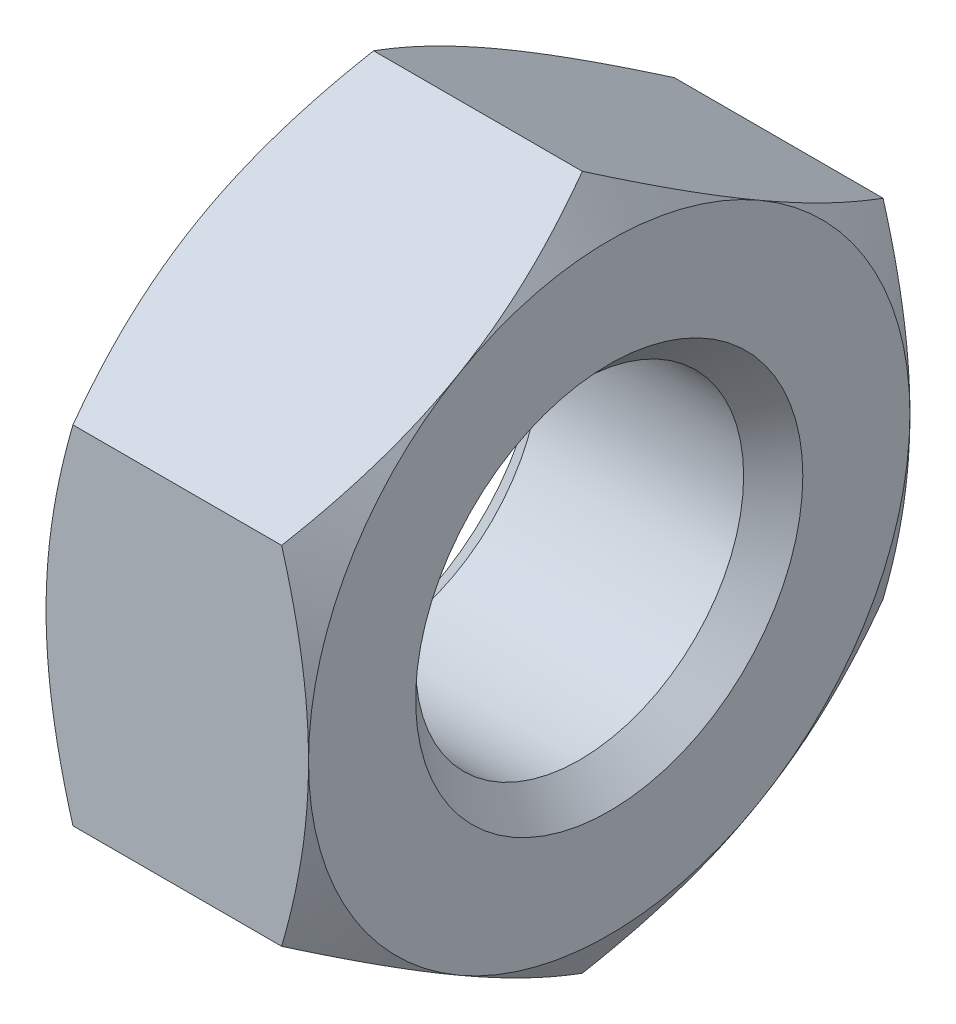
ISO-10303-21;
HEADER;
FILE_DESCRIPTION(('STEP AP214'),'2;1');
FILE_NAME('part.step','',(''),(''),'','','');
FILE_SCHEMA(('AUTOMOTIVE_DESIGN { 1 0 10303 214 1 1 1 1 }'));
ENDSEC;
DATA;
#1=APPLICATION_CONTEXT('core data for automotive mechanical design processes');
#2=APPLICATION_PROTOCOL_DEFINITION('international standard','automotive_design',2000,#1);
#3=PRODUCT_CONTEXT('',#1,'mechanical');
#4=PRODUCT('Part','Part','',(#3));
#5=PRODUCT_RELATED_PRODUCT_CATEGORY('part','',(#4));
#6=PRODUCT_DEFINITION_FORMATION('','',#4);
#7=PRODUCT_DEFINITION_CONTEXT('part definition',#1,'design');
#8=PRODUCT_DEFINITION('design','',#6,#7);
#9=PRODUCT_DEFINITION_SHAPE('','',#8);
#10=(LENGTH_UNIT() NAMED_UNIT(*) SI_UNIT(.MILLI.,.METRE.));
#11=(NAMED_UNIT(*) PLANE_ANGLE_UNIT() SI_UNIT($,.RADIAN.));
#12=(NAMED_UNIT(*) SI_UNIT($,.STERADIAN.) SOLID_ANGLE_UNIT());
#13=UNCERTAINTY_MEASURE_WITH_UNIT(LENGTH_MEASURE(1.E-05),#10,'distance_accuracy_value','');
#14=(GEOMETRIC_REPRESENTATION_CONTEXT(3) GLOBAL_UNCERTAINTY_ASSIGNED_CONTEXT((#13)) GLOBAL_UNIT_ASSIGNED_CONTEXT((#10,
#11,#12)) REPRESENTATION_CONTEXT('',''));
#15=CARTESIAN_POINT('',(0.,0.,0.));
#16=DIRECTION('',(0.,0.,1.));
#17=DIRECTION('',(1.,0.,0.));
#18=AXIS2_PLACEMENT_3D('',#15,#16,#17);
#19=CARTESIAN_POINT('',(0.,1.375,0.));
#20=DIRECTION('',(-1.,0.,0.));
#21=DIRECTION('',(0.,-1.,0.));
#22=AXIS2_PLACEMENT_3D('',#19,#20,#21);
#23=PLANE('',#22);
#24=CARTESIAN_POINT('',(0.,0.,0.));
#25=DIRECTION('',(-1.,0.,0.));
#26=DIRECTION('',(0.,-1.,0.));
#27=AXIS2_PLACEMENT_3D('',#24,#25,#26);
#28=CIRCLE('',#27,1.77062499999999);
#29=CARTESIAN_POINT('',(0.,-1.77062499999999,0.));
#30=VERTEX_POINT('',#29);
#31=EDGE_CURVE('E246',#30,#30,#28,.F.);
#32=ORIENTED_EDGE('',*,*,#31,.T.);
#33=EDGE_LOOP('',(#32));
#34=FACE_BOUND('',#33,.T.);
#35=CARTESIAN_POINT('',(0.,0.,0.));
#36=DIRECTION('',(1.,0.,0.));
#37=DIRECTION('',(0.,1.,0.));
#38=AXIS2_PLACEMENT_3D('',#35,#36,#37);
#39=CIRCLE('',#38,2.75);
#40=CARTESIAN_POINT('',(0.,2.38156986040721,-1.375));
#41=VERTEX_POINT('',#40);
#42=CARTESIAN_POINT('',(0.,2.38156986040721,1.375));
#43=VERTEX_POINT('',#42);
#44=EDGE_CURVE('E248',#41,#43,#39,.T.);
#45=ORIENTED_EDGE('',*,*,#44,.F.);
#46=CARTESIAN_POINT('',(0.,0.,0.));
#47=DIRECTION('',(1.,0.,0.));
#48=DIRECTION('',(0.,1.,0.));
#49=AXIS2_PLACEMENT_3D('',#46,#47,#48);
#50=CIRCLE('',#49,2.75);
#51=CARTESIAN_POINT('',(0.,0.,-2.75));
#52=VERTEX_POINT('',#51);
#53=EDGE_CURVE('E295',#52,#41,#50,.T.);
#54=ORIENTED_EDGE('',*,*,#53,.F.);
#55=CARTESIAN_POINT('',(0.,0.,0.));
#56=DIRECTION('',(1.,0.,0.));
#57=DIRECTION('',(0.,1.,0.));
#58=AXIS2_PLACEMENT_3D('',#55,#56,#57);
#59=CIRCLE('',#58,2.75);
#60=CARTESIAN_POINT('',(0.,-2.38156986040721,-1.375));
#61=VERTEX_POINT('',#60);
#62=EDGE_CURVE('E350',#61,#52,#59,.T.);
#63=ORIENTED_EDGE('',*,*,#62,.F.);
#64=CARTESIAN_POINT('',(0.,0.,0.));
#65=DIRECTION('',(1.,0.,0.));
#66=DIRECTION('',(0.,1.,0.));
#67=AXIS2_PLACEMENT_3D('',#64,#65,#66);
#68=CIRCLE('',#67,2.75);
#69=CARTESIAN_POINT('',(0.,-2.38156986040721,1.375));
#70=VERTEX_POINT('',#69);
#71=EDGE_CURVE('E106',#70,#61,#68,.T.);
#72=ORIENTED_EDGE('',*,*,#71,.F.);
#73=CARTESIAN_POINT('',(0.,0.,0.));
#74=DIRECTION('',(1.,0.,0.));
#75=DIRECTION('',(0.,1.,0.));
#76=AXIS2_PLACEMENT_3D('',#73,#74,#75);
#77=CIRCLE('',#76,2.75);
#78=CARTESIAN_POINT('',(0.,0.,2.75));
#79=VERTEX_POINT('',#78);
#80=EDGE_CURVE('E294',#79,#70,#77,.T.);
#81=ORIENTED_EDGE('',*,*,#80,.F.);
#82=CARTESIAN_POINT('',(0.,0.,0.));
#83=DIRECTION('',(1.,0.,0.));
#84=DIRECTION('',(0.,1.,0.));
#85=AXIS2_PLACEMENT_3D('',#82,#83,#84);
#86=CIRCLE('',#85,2.75);
#87=EDGE_CURVE('E320',#43,#79,#86,.T.);
#88=ORIENTED_EDGE('',*,*,#87,.F.);
#89=EDGE_LOOP('',(#45,#54,#63,#72,#81,#88));
#90=FACE_BOUND('',#89,.T.);
#91=ADVANCED_FACE('F55',(#34,#90),#23,.T.);
#92=CARTESIAN_POINT('',(-0.24,-2.38156986040721,-1.375));
#93=DIRECTION('',(0.,-0.866025403784439,-0.5));
#94=DIRECTION('',(0.,0.5,-0.866025403784439));
#95=AXIS2_PLACEMENT_3D('',#92,#93,#94);
#96=PLANE('',#95);
#97=CARTESIAN_POINT('',(0.246159375,-1.58677958820832,-2.75161713280996));
#98=CARTESIAN_POINT('',(0.,-2.01276454857648,-2.01378953819211));
#99=CARTESIAN_POINT('',(0.,-2.38156986040721,-1.375));
#100=CARTESIAN_POINT('',(0.,-2.75037517223794,-0.736210461807891));
#101=CARTESIAN_POINT('',(0.246159375,-3.17636013260609,0.00161713280995732));
#102=(BOUNDED_CURVE() B_SPLINE_CURVE(2,(#97,#98,#99,#100,#101),.UNSPECIFIED.,.F.,
.F.) B_SPLINE_CURVE_WITH_KNOTS((3,2,3),(0.,1.61264149368119,3.22528298736238),
.UNSPECIFIED.) CURVE() GEOMETRIC_REPRESENTATION_ITEM() RATIONAL_B_SPLINE_CURVE((1.,
1.03803665588276,1.,1.03803665588276,1.)) REPRESENTATION_ITEM(''));
#103=CARTESIAN_POINT('',(0.245620093061863,-1.58771324027147,-2.75));
#104=VERTEX_POINT('',#103);
#105=EDGE_CURVE('E292',#104,#61,#102,.T.);
#106=ORIENTED_EDGE('',*,*,#105,.F.);
#107=DIRECTION('',(1.,0.,0.));
#108=VECTOR('',#107,1.);
#109=CARTESIAN_POINT('',(-0.24,-1.58771324027147,-2.75));
#110=LINE('',#109,#108);
#111=CARTESIAN_POINT('',(2.15437990693814,-1.58771324027147,-2.75));
#112=VERTEX_POINT('',#111);
#113=EDGE_CURVE('E72',#104,#112,#110,.T.);
#114=ORIENTED_EDGE('',*,*,#113,.T.);
#115=CARTESIAN_POINT('',(2.153840625,-3.17636013260609,0.0016171328099566));
#116=CARTESIAN_POINT('',(2.4,-2.75037517223793,-0.736210461807895));
#117=CARTESIAN_POINT('',(2.4,-2.38156986040721,-1.375));
#118=CARTESIAN_POINT('',(2.4,-2.01276454857647,-2.01378953819211));
#119=CARTESIAN_POINT('',(2.153840625,-1.58677958820832,-2.75161713280996));
#120=(BOUNDED_CURVE() B_SPLINE_CURVE(2,(#115,#116,#117,#118,#119),.UNSPECIFIED.,.F.,
.F.) B_SPLINE_CURVE_WITH_KNOTS((3,2,3),(0.,1.61264149368119,3.22528298736238),
.UNSPECIFIED.) CURVE() GEOMETRIC_REPRESENTATION_ITEM() RATIONAL_B_SPLINE_CURVE((1.,
1.03803665588275,1.,1.03803665588276,1.)) REPRESENTATION_ITEM(''));
#121=CARTESIAN_POINT('',(2.4,-2.38156986040721,-1.375));
#122=VERTEX_POINT('',#121);
#123=EDGE_CURVE('E390',#122,#112,#120,.T.);
#124=ORIENTED_EDGE('',*,*,#123,.F.);
#125=CARTESIAN_POINT('',(2.153840625,-3.17636013260609,0.0016171328099566));
#126=CARTESIAN_POINT('',(2.4,-2.75037517223793,-0.736210461807895));
#127=CARTESIAN_POINT('',(2.4,-2.38156986040721,-1.375));
#128=CARTESIAN_POINT('',(2.4,-2.01276454857647,-2.01378953819211));
#129=CARTESIAN_POINT('',(2.153840625,-1.58677958820832,-2.75161713280996));
#130=(BOUNDED_CURVE() B_SPLINE_CURVE(2,(#125,#126,#127,#128,#129),.UNSPECIFIED.,.F.,
.F.) B_SPLINE_CURVE_WITH_KNOTS((3,2,3),(0.,1.61264149368119,3.22528298736238),
.UNSPECIFIED.) CURVE() GEOMETRIC_REPRESENTATION_ITEM() RATIONAL_B_SPLINE_CURVE((1.,
1.03803665588275,1.,1.03803665588276,1.)) REPRESENTATION_ITEM(''));
#131=CARTESIAN_POINT('',(2.15437990693814,-3.17542648054294,0.));
#132=VERTEX_POINT('',#131);
#133=EDGE_CURVE('E212',#132,#122,#130,.T.);
#134=ORIENTED_EDGE('',*,*,#133,.F.);
#135=DIRECTION('',(1.,0.,0.));
#136=VECTOR('',#135,1.);
#137=CARTESIAN_POINT('',(-0.24,-3.17542648054294,0.));
#138=LINE('',#137,#136);
#139=CARTESIAN_POINT('',(0.245620093061863,-3.17542648054294,0.));
#140=VERTEX_POINT('',#139);
#141=EDGE_CURVE('E147',#140,#132,#138,.T.);
#142=ORIENTED_EDGE('',*,*,#141,.F.);
#143=CARTESIAN_POINT('',(0.246159375,-1.58677958820832,-2.75161713280996));
#144=CARTESIAN_POINT('',(0.,-2.01276454857648,-2.01378953819211));
#145=CARTESIAN_POINT('',(0.,-2.38156986040721,-1.375));
#146=CARTESIAN_POINT('',(0.,-2.75037517223794,-0.736210461807891));
#147=CARTESIAN_POINT('',(0.246159375,-3.17636013260609,0.00161713280995732));
#148=(BOUNDED_CURVE() B_SPLINE_CURVE(2,(#143,#144,#145,#146,#147),.UNSPECIFIED.,.F.,
.F.) B_SPLINE_CURVE_WITH_KNOTS((3,2,3),(0.,1.61264149368119,3.22528298736238),
.UNSPECIFIED.) CURVE() GEOMETRIC_REPRESENTATION_ITEM() RATIONAL_B_SPLINE_CURVE((1.,
1.03803665588276,1.,1.03803665588276,1.)) REPRESENTATION_ITEM(''));
#149=EDGE_CURVE('E348',#61,#140,#148,.T.);
#150=ORIENTED_EDGE('',*,*,#149,.F.);
#151=EDGE_LOOP('',(#106,#114,#124,#134,#142,#150));
#152=FACE_BOUND('',#151,.T.);
#153=ADVANCED_FACE('F406',(#152),#96,.T.);
#154=CARTESIAN_POINT('',(-0.24,0.,-2.75));
#155=DIRECTION('',(0.,0.,-1.));
#156=DIRECTION('',(0.,1.,0.));
#157=AXIS2_PLACEMENT_3D('',#154,#155,#156);
#158=PLANE('',#157);
#159=CARTESIAN_POINT('',(0.246159375,1.58958054439776,-2.75));
#160=CARTESIAN_POINT('',(0.,0.737610623661457,-2.75));
#161=CARTESIAN_POINT('',(0.,0.,-2.75));
#162=CARTESIAN_POINT('',(0.,-0.737610623661457,-2.75));
#163=CARTESIAN_POINT('',(0.246159375,-1.58958054439776,-2.75));
#164=(BOUNDED_CURVE() B_SPLINE_CURVE(2,(#159,#160,#161,#162,#163),.UNSPECIFIED.,.F.,
.F.) B_SPLINE_CURVE_WITH_KNOTS((3,2,3),(0.,1.61264149368119,3.22528298736238),
.UNSPECIFIED.) CURVE() GEOMETRIC_REPRESENTATION_ITEM() RATIONAL_B_SPLINE_CURVE((1.,
1.03803665588276,1.,1.03803665588276,1.)) REPRESENTATION_ITEM(''));
#165=CARTESIAN_POINT('',(0.245620093061863,1.58771324027147,-2.75));
#166=VERTEX_POINT('',#165);
#167=EDGE_CURVE('E148',#166,#52,#164,.T.);
#168=ORIENTED_EDGE('',*,*,#167,.F.);
#169=DIRECTION('',(1.,0.,0.));
#170=VECTOR('',#169,1.);
#171=CARTESIAN_POINT('',(-0.24,1.58771324027147,-2.75));
#172=LINE('',#171,#170);
#173=CARTESIAN_POINT('',(2.15437990693814,1.58771324027147,-2.75));
#174=VERTEX_POINT('',#173);
#175=EDGE_CURVE('E136',#166,#174,#172,.T.);
#176=ORIENTED_EDGE('',*,*,#175,.T.);
#177=CARTESIAN_POINT('',(2.153840625,-1.58958054439775,-2.75));
#178=CARTESIAN_POINT('',(2.4,-0.737610623661457,-2.75));
#179=CARTESIAN_POINT('',(2.4,0.,-2.75));
#180=CARTESIAN_POINT('',(2.4,0.737610623661457,-2.75));
#181=CARTESIAN_POINT('',(2.153840625,1.58958054439775,-2.75));
#182=(BOUNDED_CURVE() B_SPLINE_CURVE(2,(#177,#178,#179,#180,#181),.UNSPECIFIED.,.F.,
.F.) B_SPLINE_CURVE_WITH_KNOTS((3,2,3),(0.,1.61264149368119,3.22528298736238),
.UNSPECIFIED.) CURVE() GEOMETRIC_REPRESENTATION_ITEM() RATIONAL_B_SPLINE_CURVE((1.,
1.03803665588277,1.,1.03803665588277,1.)) REPRESENTATION_ITEM(''));
#183=CARTESIAN_POINT('',(2.4,0.,-2.75));
#184=VERTEX_POINT('',#183);
#185=EDGE_CURVE('E141',#184,#174,#182,.T.);
#186=ORIENTED_EDGE('',*,*,#185,.F.);
#187=CARTESIAN_POINT('',(2.153840625,-1.58958054439775,-2.75));
#188=CARTESIAN_POINT('',(2.4,-0.737610623661457,-2.75));
#189=CARTESIAN_POINT('',(2.4,0.,-2.75));
#190=CARTESIAN_POINT('',(2.4,0.737610623661457,-2.75));
#191=CARTESIAN_POINT('',(2.153840625,1.58958054439775,-2.75));
#192=(BOUNDED_CURVE() B_SPLINE_CURVE(2,(#187,#188,#189,#190,#191),.UNSPECIFIED.,.F.,
.F.) B_SPLINE_CURVE_WITH_KNOTS((3,2,3),(0.,1.61264149368119,3.22528298736238),
.UNSPECIFIED.) CURVE() GEOMETRIC_REPRESENTATION_ITEM() RATIONAL_B_SPLINE_CURVE((1.,
1.03803665588277,1.,1.03803665588277,1.)) REPRESENTATION_ITEM(''));
#193=EDGE_CURVE('E380',#112,#184,#192,.T.);
#194=ORIENTED_EDGE('',*,*,#193,.F.);
#195=ORIENTED_EDGE('',*,*,#113,.F.);
#196=CARTESIAN_POINT('',(0.246159375,1.58958054439776,-2.75));
#197=CARTESIAN_POINT('',(0.,0.737610623661457,-2.75));
#198=CARTESIAN_POINT('',(0.,0.,-2.75));
#199=CARTESIAN_POINT('',(0.,-0.737610623661457,-2.75));
#200=CARTESIAN_POINT('',(0.246159375,-1.58958054439776,-2.75));
#201=(BOUNDED_CURVE() B_SPLINE_CURVE(2,(#196,#197,#198,#199,#200),.UNSPECIFIED.,.F.,
.F.) B_SPLINE_CURVE_WITH_KNOTS((3,2,3),(0.,1.61264149368119,3.22528298736238),
.UNSPECIFIED.) CURVE() GEOMETRIC_REPRESENTATION_ITEM() RATIONAL_B_SPLINE_CURVE((1.,
1.03803665588276,1.,1.03803665588276,1.)) REPRESENTATION_ITEM(''));
#202=EDGE_CURVE('E284',#52,#104,#201,.T.);
#203=ORIENTED_EDGE('',*,*,#202,.F.);
#204=EDGE_LOOP('',(#168,#176,#186,#194,#195,#203));
#205=FACE_BOUND('',#204,.T.);
#206=ADVANCED_FACE('F142',(#205),#158,.T.);
#207=CARTESIAN_POINT('',(-0.24,2.38156986040721,-1.375));
#208=DIRECTION('',(0.,0.866025403784439,-0.5));
#209=DIRECTION('',(0.,0.5,0.866025403784439));
#210=AXIS2_PLACEMENT_3D('',#207,#208,#209);
#211=PLANE('',#210);
#212=CARTESIAN_POINT('',(0.246159375,3.17636013260609,0.00161713280995494));
#213=CARTESIAN_POINT('',(0.,2.75037517223794,-0.736210461807897));
#214=CARTESIAN_POINT('',(0.,2.38156986040721,-1.375));
#215=CARTESIAN_POINT('',(0.,2.01276454857648,-2.01378953819211));
#216=CARTESIAN_POINT('',(0.246159375,1.58677958820832,-2.75161713280996));
#217=(BOUNDED_CURVE() B_SPLINE_CURVE(2,(#212,#213,#214,#215,#216),.UNSPECIFIED.,.F.,
.F.) B_SPLINE_CURVE_WITH_KNOTS((3,2,3),(0.,1.61264149368119,3.22528298736238),
.UNSPECIFIED.) CURVE() GEOMETRIC_REPRESENTATION_ITEM() RATIONAL_B_SPLINE_CURVE((1.,
1.03803665588275,1.,1.03803665588274,1.)) REPRESENTATION_ITEM(''));
#218=CARTESIAN_POINT('',(0.245620093061863,3.17542648054294,0.));
#219=VERTEX_POINT('',#218);
#220=EDGE_CURVE('E240',#219,#41,#217,.T.);
#221=ORIENTED_EDGE('',*,*,#220,.F.);
#222=DIRECTION('',(1.,0.,0.));
#223=VECTOR('',#222,1.);
#224=CARTESIAN_POINT('',(-0.24,3.17542648054294,0.));
#225=LINE('',#224,#223);
#226=CARTESIAN_POINT('',(2.15437990693814,3.17542648054294,0.));
#227=VERTEX_POINT('',#226);
#228=EDGE_CURVE('E392',#219,#227,#225,.T.);
#229=ORIENTED_EDGE('',*,*,#228,.T.);
#230=CARTESIAN_POINT('',(2.153840625,1.58677958820832,-2.75161713280996));
#231=CARTESIAN_POINT('',(2.4,2.01276454857648,-2.01378953819211));
#232=CARTESIAN_POINT('',(2.4,2.38156986040721,-1.375));
#233=CARTESIAN_POINT('',(2.4,2.75037517223793,-0.736210461807894));
#234=CARTESIAN_POINT('',(2.153840625,3.17636013260609,0.00161713280995446));
#235=(BOUNDED_CURVE() B_SPLINE_CURVE(2,(#230,#231,#232,#233,#234),.UNSPECIFIED.,.F.,
.F.) B_SPLINE_CURVE_WITH_KNOTS((3,2,3),(0.,1.61264149368119,3.22528298736238),
.UNSPECIFIED.) CURVE() GEOMETRIC_REPRESENTATION_ITEM() RATIONAL_B_SPLINE_CURVE((1.,
1.03803665588275,1.,1.03803665588276,1.)) REPRESENTATION_ITEM(''));
#236=CARTESIAN_POINT('',(2.4,2.38156986040721,-1.375));
#237=VERTEX_POINT('',#236);
#238=EDGE_CURVE('E133',#237,#227,#235,.T.);
#239=ORIENTED_EDGE('',*,*,#238,.F.);
#240=CARTESIAN_POINT('',(2.153840625,1.58677958820832,-2.75161713280996));
#241=CARTESIAN_POINT('',(2.4,2.01276454857648,-2.01378953819211));
#242=CARTESIAN_POINT('',(2.4,2.38156986040721,-1.375));
#243=CARTESIAN_POINT('',(2.4,2.75037517223793,-0.736210461807894));
#244=CARTESIAN_POINT('',(2.153840625,3.17636013260609,0.00161713280995446));
#245=(BOUNDED_CURVE() B_SPLINE_CURVE(2,(#240,#241,#242,#243,#244),.UNSPECIFIED.,.F.,
.F.) B_SPLINE_CURVE_WITH_KNOTS((3,2,3),(0.,1.61264149368119,3.22528298736238),
.UNSPECIFIED.) CURVE() GEOMETRIC_REPRESENTATION_ITEM() RATIONAL_B_SPLINE_CURVE((1.,
1.03803665588275,1.,1.03803665588276,1.)) REPRESENTATION_ITEM(''));
#246=EDGE_CURVE('E154',#174,#237,#245,.T.);
#247=ORIENTED_EDGE('',*,*,#246,.F.);
#248=ORIENTED_EDGE('',*,*,#175,.F.);
#249=CARTESIAN_POINT('',(0.246159375,3.17636013260609,0.00161713280995494));
#250=CARTESIAN_POINT('',(0.,2.75037517223794,-0.736210461807897));
#251=CARTESIAN_POINT('',(0.,2.38156986040721,-1.375));
#252=CARTESIAN_POINT('',(0.,2.01276454857648,-2.01378953819211));
#253=CARTESIAN_POINT('',(0.246159375,1.58677958820832,-2.75161713280996));
#254=(BOUNDED_CURVE() B_SPLINE_CURVE(2,(#249,#250,#251,#252,#253),.UNSPECIFIED.,.F.,
.F.) B_SPLINE_CURVE_WITH_KNOTS((3,2,3),(0.,1.61264149368119,3.22528298736238),
.UNSPECIFIED.) CURVE() GEOMETRIC_REPRESENTATION_ITEM() RATIONAL_B_SPLINE_CURVE((1.,
1.03803665588275,1.,1.03803665588274,1.)) REPRESENTATION_ITEM(''));
#255=EDGE_CURVE('E266',#41,#166,#254,.T.);
#256=ORIENTED_EDGE('',*,*,#255,.F.);
#257=EDGE_LOOP('',(#221,#229,#239,#247,#248,#256));
#258=FACE_BOUND('',#257,.T.);
#259=ADVANCED_FACE('F165',(#258),#211,.T.);
#260=CARTESIAN_POINT('',(-0.24,-2.38156986040721,1.375));
#261=DIRECTION('',(0.,-0.866025403784439,0.5));
#262=DIRECTION('',(0.,-0.5,-0.866025403784439));
#263=AXIS2_PLACEMENT_3D('',#260,#261,#262);
#264=PLANE('',#263);
#265=CARTESIAN_POINT('',(0.246159375,-3.17636013260609,-0.00161713280995565));
#266=CARTESIAN_POINT('',(0.,-2.75037517223793,0.736210461807893));
#267=CARTESIAN_POINT('',(0.,-2.38156986040721,1.375));
#268=CARTESIAN_POINT('',(0.,-2.01276454857648,2.0137895381921));
#269=CARTESIAN_POINT('',(0.246159375,-1.58677958820832,2.75161713280996));
#270=(BOUNDED_CURVE() B_SPLINE_CURVE(2,(#265,#266,#267,#268,#269),.UNSPECIFIED.,.F.,
.F.) B_SPLINE_CURVE_WITH_KNOTS((3,2,3),(0.,1.61264149368119,3.22528298736238),
.UNSPECIFIED.) CURVE() GEOMETRIC_REPRESENTATION_ITEM() RATIONAL_B_SPLINE_CURVE((1.,
1.03803665588275,1.,1.03803665588276,1.)) REPRESENTATION_ITEM(''));
#271=CARTESIAN_POINT('',(0.245620093061863,-1.58771324027147,2.75));
#272=VERTEX_POINT('',#271);
#273=EDGE_CURVE('E303',#70,#272,#270,.T.);
#274=ORIENTED_EDGE('',*,*,#273,.F.);
#275=CARTESIAN_POINT('',(0.246159375,-3.17636013260609,-0.00161713280995565));
#276=CARTESIAN_POINT('',(0.,-2.75037517223793,0.736210461807893));
#277=CARTESIAN_POINT('',(0.,-2.38156986040721,1.375));
#278=CARTESIAN_POINT('',(0.,-2.01276454857648,2.0137895381921));
#279=CARTESIAN_POINT('',(0.246159375,-1.58677958820832,2.75161713280996));
#280=(BOUNDED_CURVE() B_SPLINE_CURVE(2,(#275,#276,#277,#278,#279),.UNSPECIFIED.,.F.,
.F.) B_SPLINE_CURVE_WITH_KNOTS((3,2,3),(0.,1.61264149368119,3.22528298736238),
.UNSPECIFIED.) CURVE() GEOMETRIC_REPRESENTATION_ITEM() RATIONAL_B_SPLINE_CURVE((1.,
1.03803665588275,1.,1.03803665588276,1.)) REPRESENTATION_ITEM(''));
#281=EDGE_CURVE('E166',#140,#70,#280,.T.);
#282=ORIENTED_EDGE('',*,*,#281,.F.);
#283=ORIENTED_EDGE('',*,*,#141,.T.);
#284=CARTESIAN_POINT('',(2.153840625,-1.58677958820832,2.75161713280996));
#285=CARTESIAN_POINT('',(2.4,-2.01276454857648,2.01378953819211));
#286=CARTESIAN_POINT('',(2.4,-2.38156986040721,1.375));
#287=CARTESIAN_POINT('',(2.4,-2.75037517223794,0.736210461807893));
#288=CARTESIAN_POINT('',(2.153840625,-3.17636013260609,-0.00161713280995589));
#289=(BOUNDED_CURVE() B_SPLINE_CURVE(2,(#284,#285,#286,#287,#288),.UNSPECIFIED.,.F.,
.F.) B_SPLINE_CURVE_WITH_KNOTS((3,2,3),(0.,1.61264149368119,3.22528298736238),
.UNSPECIFIED.) CURVE() GEOMETRIC_REPRESENTATION_ITEM() RATIONAL_B_SPLINE_CURVE((1.,
1.03803665588276,1.,1.03803665588275,1.)) REPRESENTATION_ITEM(''));
#290=CARTESIAN_POINT('',(2.4,-2.38156986040721,1.375));
#291=VERTEX_POINT('',#290);
#292=EDGE_CURVE('E336',#291,#132,#289,.T.);
#293=ORIENTED_EDGE('',*,*,#292,.F.);
#294=CARTESIAN_POINT('',(2.153840625,-1.58677958820832,2.75161713280996));
#295=CARTESIAN_POINT('',(2.4,-2.01276454857648,2.01378953819211));
#296=CARTESIAN_POINT('',(2.4,-2.38156986040721,1.375));
#297=CARTESIAN_POINT('',(2.4,-2.75037517223794,0.736210461807893));
#298=CARTESIAN_POINT('',(2.153840625,-3.17636013260609,-0.00161713280995589));
#299=(BOUNDED_CURVE() B_SPLINE_CURVE(2,(#294,#295,#296,#297,#298),.UNSPECIFIED.,.F.,
.F.) B_SPLINE_CURVE_WITH_KNOTS((3,2,3),(0.,1.61264149368119,3.22528298736238),
.UNSPECIFIED.) CURVE() GEOMETRIC_REPRESENTATION_ITEM() RATIONAL_B_SPLINE_CURVE((1.,
1.03803665588276,1.,1.03803665588275,1.)) REPRESENTATION_ITEM(''));
#300=CARTESIAN_POINT('',(2.15437990693814,-1.58771324027147,2.75));
#301=VERTEX_POINT('',#300);
#302=EDGE_CURVE('E207',#301,#291,#299,.T.);
#303=ORIENTED_EDGE('',*,*,#302,.F.);
#304=DIRECTION('',(1.,0.,0.));
#305=VECTOR('',#304,1.);
#306=CARTESIAN_POINT('',(-0.24,-1.58771324027147,2.75));
#307=LINE('',#306,#305);
#308=EDGE_CURVE('E389',#272,#301,#307,.T.);
#309=ORIENTED_EDGE('',*,*,#308,.F.);
#310=EDGE_LOOP('',(#274,#282,#283,#293,#303,#309));
#311=FACE_BOUND('',#310,.T.);
#312=ADVANCED_FACE('F402',(#311),#264,.T.);
#313=CARTESIAN_POINT('',(-0.24,0.,2.75));
#314=DIRECTION('',(0.,0.,1.));
#315=DIRECTION('',(0.,-1.,0.));
#316=AXIS2_PLACEMENT_3D('',#313,#314,#315);
#317=PLANE('',#316);
#318=CARTESIAN_POINT('',(0.246159375,-1.58958054439776,2.75));
#319=CARTESIAN_POINT('',(0.,-0.73761062366146,2.75));
#320=CARTESIAN_POINT('',(0.,0.,2.75));
#321=CARTESIAN_POINT('',(0.,0.737610623661461,2.75));
#322=CARTESIAN_POINT('',(0.246159375,1.58958054439776,2.75));
#323=(BOUNDED_CURVE() B_SPLINE_CURVE(2,(#318,#319,#320,#321,#322),.UNSPECIFIED.,.F.,
.F.) B_SPLINE_CURVE_WITH_KNOTS((3,2,3),(0.,1.6126414936812,3.22528298736238),
.UNSPECIFIED.) CURVE() GEOMETRIC_REPRESENTATION_ITEM() RATIONAL_B_SPLINE_CURVE((1.,
1.03803665588276,1.,1.03803665588276,1.)) REPRESENTATION_ITEM(''));
#324=CARTESIAN_POINT('',(0.245620093061863,1.58771324027147,2.75));
#325=VERTEX_POINT('',#324);
#326=EDGE_CURVE('E249',#79,#325,#323,.T.);
#327=ORIENTED_EDGE('',*,*,#326,.F.);
#328=CARTESIAN_POINT('',(0.246159375,-1.58958054439776,2.75));
#329=CARTESIAN_POINT('',(0.,-0.73761062366146,2.75));
#330=CARTESIAN_POINT('',(0.,0.,2.75));
#331=CARTESIAN_POINT('',(0.,0.737610623661461,2.75));
#332=CARTESIAN_POINT('',(0.246159375,1.58958054439776,2.75));
#333=(BOUNDED_CURVE() B_SPLINE_CURVE(2,(#328,#329,#330,#331,#332),.UNSPECIFIED.,.F.,
.F.) B_SPLINE_CURVE_WITH_KNOTS((3,2,3),(0.,1.6126414936812,3.22528298736238),
.UNSPECIFIED.) CURVE() GEOMETRIC_REPRESENTATION_ITEM() RATIONAL_B_SPLINE_CURVE((1.,
1.03803665588276,1.,1.03803665588276,1.)) REPRESENTATION_ITEM(''));
#334=EDGE_CURVE('E272',#272,#79,#333,.T.);
#335=ORIENTED_EDGE('',*,*,#334,.F.);
#336=ORIENTED_EDGE('',*,*,#308,.T.);
#337=CARTESIAN_POINT('',(2.153840625,1.58958054439776,2.75));
#338=CARTESIAN_POINT('',(2.40000000000001,0.737610623661459,2.75));
#339=CARTESIAN_POINT('',(2.4,0.,2.75));
#340=CARTESIAN_POINT('',(2.40000000000001,-0.737610623661457,2.75));
#341=CARTESIAN_POINT('',(2.153840625,-1.58958054439775,2.75));
#342=(BOUNDED_CURVE() B_SPLINE_CURVE(2,(#337,#338,#339,#340,#341),.UNSPECIFIED.,.F.,
.F.) B_SPLINE_CURVE_WITH_KNOTS((3,2,3),(0.,1.61264149368119,3.22528298736238),
.UNSPECIFIED.) CURVE() GEOMETRIC_REPRESENTATION_ITEM() RATIONAL_B_SPLINE_CURVE((1.,
1.03803665588276,1.,1.03803665588276,1.)) REPRESENTATION_ITEM(''));
#343=CARTESIAN_POINT('',(2.4,0.,2.75));
#344=VERTEX_POINT('',#343);
#345=EDGE_CURVE('E230',#344,#301,#342,.T.);
#346=ORIENTED_EDGE('',*,*,#345,.F.);
#347=CARTESIAN_POINT('',(2.153840625,1.58958054439776,2.75));
#348=CARTESIAN_POINT('',(2.40000000000001,0.737610623661459,2.75));
#349=CARTESIAN_POINT('',(2.4,0.,2.75));
#350=CARTESIAN_POINT('',(2.40000000000001,-0.737610623661457,2.75));
#351=CARTESIAN_POINT('',(2.153840625,-1.58958054439775,2.75));
#352=(BOUNDED_CURVE() B_SPLINE_CURVE(2,(#347,#348,#349,#350,#351),.UNSPECIFIED.,.F.,
.F.) B_SPLINE_CURVE_WITH_KNOTS((3,2,3),(0.,1.61264149368119,3.22528298736238),
.UNSPECIFIED.) CURVE() GEOMETRIC_REPRESENTATION_ITEM() RATIONAL_B_SPLINE_CURVE((1.,
1.03803665588276,1.,1.03803665588276,1.)) REPRESENTATION_ITEM(''));
#353=CARTESIAN_POINT('',(2.15437990693814,1.58771324027147,2.75));
#354=VERTEX_POINT('',#353);
#355=EDGE_CURVE('E199',#354,#344,#352,.T.);
#356=ORIENTED_EDGE('',*,*,#355,.F.);
#357=DIRECTION('',(1.,0.,0.));
#358=VECTOR('',#357,1.);
#359=CARTESIAN_POINT('',(-0.24,1.58771324027147,2.75));
#360=LINE('',#359,#358);
#361=EDGE_CURVE('E532',#325,#354,#360,.T.);
#362=ORIENTED_EDGE('',*,*,#361,.F.);
#363=EDGE_LOOP('',(#327,#335,#336,#346,#356,#362));
#364=FACE_BOUND('',#363,.T.);
#365=ADVANCED_FACE('F434',(#364),#317,.T.);
#366=CARTESIAN_POINT('',(-0.24,2.38156986040721,1.375));
#367=DIRECTION('',(0.,0.866025403784439,0.5));
#368=DIRECTION('',(0.,-0.5,0.866025403784439));
#369=AXIS2_PLACEMENT_3D('',#366,#367,#368);
#370=PLANE('',#369);
#371=CARTESIAN_POINT('',(0.246159375,1.58677958820833,2.75161713280996));
#372=CARTESIAN_POINT('',(0.,2.01276454857648,2.01378953819211));
#373=CARTESIAN_POINT('',(0.,2.38156986040721,1.375));
#374=CARTESIAN_POINT('',(0.,2.75037517223794,0.736210461807893));
#375=CARTESIAN_POINT('',(0.246159375,3.17636013260609,-0.00161713280995732));
#376=(BOUNDED_CURVE() B_SPLINE_CURVE(2,(#371,#372,#373,#374,#375),.UNSPECIFIED.,.F.,
.F.) B_SPLINE_CURVE_WITH_KNOTS((3,2,3),(0.,1.61264149368119,3.22528298736238),
.UNSPECIFIED.) CURVE() GEOMETRIC_REPRESENTATION_ITEM() RATIONAL_B_SPLINE_CURVE((1.,
1.03803665588275,1.,1.03803665588276,1.)) REPRESENTATION_ITEM(''));
#377=EDGE_CURVE('E275',#43,#219,#376,.T.);
#378=ORIENTED_EDGE('',*,*,#377,.F.);
#379=CARTESIAN_POINT('',(0.246159375,1.58677958820833,2.75161713280996));
#380=CARTESIAN_POINT('',(0.,2.01276454857648,2.01378953819211));
#381=CARTESIAN_POINT('',(0.,2.38156986040721,1.375));
#382=CARTESIAN_POINT('',(0.,2.75037517223794,0.736210461807893));
#383=CARTESIAN_POINT('',(0.246159375,3.17636013260609,-0.00161713280995732));
#384=(BOUNDED_CURVE() B_SPLINE_CURVE(2,(#379,#380,#381,#382,#383),.UNSPECIFIED.,.F.,
.F.) B_SPLINE_CURVE_WITH_KNOTS((3,2,3),(0.,1.61264149368119,3.22528298736238),
.UNSPECIFIED.) CURVE() GEOMETRIC_REPRESENTATION_ITEM() RATIONAL_B_SPLINE_CURVE((1.,
1.03803665588275,1.,1.03803665588276,1.)) REPRESENTATION_ITEM(''));
#385=EDGE_CURVE('E325',#325,#43,#384,.T.);
#386=ORIENTED_EDGE('',*,*,#385,.F.);
#387=ORIENTED_EDGE('',*,*,#361,.T.);
#388=CARTESIAN_POINT('',(2.153840625,3.17636013260609,-0.0016171328099566));
#389=CARTESIAN_POINT('',(2.4,2.75037517223794,0.736210461807892));
#390=CARTESIAN_POINT('',(2.4,2.38156986040721,1.375));
#391=CARTESIAN_POINT('',(2.4,2.01276454857648,2.01378953819211));
#392=CARTESIAN_POINT('',(2.153840625,1.58677958820833,2.75161713280996));
#393=(BOUNDED_CURVE() B_SPLINE_CURVE(2,(#388,#389,#390,#391,#392),.UNSPECIFIED.,.F.,
.F.) B_SPLINE_CURVE_WITH_KNOTS((3,2,3),(0.,1.61264149368119,3.22528298736238),
.UNSPECIFIED.) CURVE() GEOMETRIC_REPRESENTATION_ITEM() RATIONAL_B_SPLINE_CURVE((1.,
1.03803665588277,1.,1.03803665588275,1.)) REPRESENTATION_ITEM(''));
#394=CARTESIAN_POINT('',(2.4,2.38156986040721,1.375));
#395=VERTEX_POINT('',#394);
#396=EDGE_CURVE('E231',#395,#354,#393,.T.);
#397=ORIENTED_EDGE('',*,*,#396,.F.);
#398=CARTESIAN_POINT('',(2.153840625,3.17636013260609,-0.0016171328099566));
#399=CARTESIAN_POINT('',(2.4,2.75037517223794,0.736210461807892));
#400=CARTESIAN_POINT('',(2.4,2.38156986040721,1.375));
#401=CARTESIAN_POINT('',(2.4,2.01276454857648,2.01378953819211));
#402=CARTESIAN_POINT('',(2.153840625,1.58677958820833,2.75161713280996));
#403=(BOUNDED_CURVE() B_SPLINE_CURVE(2,(#398,#399,#400,#401,#402),.UNSPECIFIED.,.F.,
.F.) B_SPLINE_CURVE_WITH_KNOTS((3,2,3),(0.,1.61264149368119,3.22528298736238),
.UNSPECIFIED.) CURVE() GEOMETRIC_REPRESENTATION_ITEM() RATIONAL_B_SPLINE_CURVE((1.,
1.03803665588277,1.,1.03803665588275,1.)) REPRESENTATION_ITEM(''));
#404=EDGE_CURVE('E157',#227,#395,#403,.T.);
#405=ORIENTED_EDGE('',*,*,#404,.F.);
#406=ORIENTED_EDGE('',*,*,#228,.F.);
#407=EDGE_LOOP('',(#378,#386,#387,#397,#405,#406));
#408=FACE_BOUND('',#407,.T.);
#409=ADVANCED_FACE('F677',(#408),#370,.T.);
#410=CARTESIAN_POINT('',(2.4,1.375,0.));
#411=DIRECTION('',(1.,0.,0.));
#412=DIRECTION('',(0.,1.,0.));
#413=AXIS2_PLACEMENT_3D('',#410,#411,#412);
#414=PLANE('',#413);
#415=CARTESIAN_POINT('',(2.4,0.,0.));
#416=DIRECTION('',(1.,0.,0.));
#417=DIRECTION('',(0.,0.,-1.));
#418=AXIS2_PLACEMENT_3D('',#415,#416,#417);
#419=CIRCLE('',#418,1.77062499999999);
#420=CARTESIAN_POINT('',(2.4,0.,-1.77062499999999));
#421=VERTEX_POINT('',#420);
#422=EDGE_CURVE('E12',#421,#421,#419,.F.);
#423=ORIENTED_EDGE('',*,*,#422,.T.);
#424=EDGE_LOOP('',(#423));
#425=FACE_BOUND('',#424,.T.);
#426=CARTESIAN_POINT('',(2.4,0.,0.));
#427=DIRECTION('',(1.,0.,0.));
#428=DIRECTION('',(0.,1.,0.));
#429=AXIS2_PLACEMENT_3D('',#426,#427,#428);
#430=CIRCLE('',#429,2.75);
#431=EDGE_CURVE('E376',#237,#395,#430,.T.);
#432=ORIENTED_EDGE('',*,*,#431,.T.);
#433=CARTESIAN_POINT('',(2.4,0.,0.));
#434=DIRECTION('',(1.,0.,0.));
#435=DIRECTION('',(0.,1.,0.));
#436=AXIS2_PLACEMENT_3D('',#433,#434,#435);
#437=CIRCLE('',#436,2.75);
#438=EDGE_CURVE('E208',#395,#344,#437,.T.);
#439=ORIENTED_EDGE('',*,*,#438,.T.);
#440=CARTESIAN_POINT('',(2.4,0.,0.));
#441=DIRECTION('',(1.,0.,0.));
#442=DIRECTION('',(0.,1.,0.));
#443=AXIS2_PLACEMENT_3D('',#440,#441,#442);
#444=CIRCLE('',#443,2.75);
#445=EDGE_CURVE('E351',#344,#291,#444,.T.);
#446=ORIENTED_EDGE('',*,*,#445,.T.);
#447=CARTESIAN_POINT('',(2.4,0.,0.));
#448=DIRECTION('',(1.,0.,0.));
#449=DIRECTION('',(0.,1.,0.));
#450=AXIS2_PLACEMENT_3D('',#447,#448,#449);
#451=CIRCLE('',#450,2.75);
#452=EDGE_CURVE('E324',#291,#122,#451,.T.);
#453=ORIENTED_EDGE('',*,*,#452,.T.);
#454=CARTESIAN_POINT('',(2.4,0.,0.));
#455=DIRECTION('',(1.,0.,0.));
#456=DIRECTION('',(0.,1.,0.));
#457=AXIS2_PLACEMENT_3D('',#454,#455,#456);
#458=CIRCLE('',#457,2.75);
#459=EDGE_CURVE('E323',#122,#184,#458,.T.);
#460=ORIENTED_EDGE('',*,*,#459,.T.);
#461=CARTESIAN_POINT('',(2.4,0.,0.));
#462=DIRECTION('',(1.,0.,0.));
#463=DIRECTION('',(0.,1.,0.));
#464=AXIS2_PLACEMENT_3D('',#461,#462,#463);
#465=CIRCLE('',#464,2.75);
#466=EDGE_CURVE('E160',#184,#237,#465,.T.);
#467=ORIENTED_EDGE('',*,*,#466,.T.);
#468=EDGE_LOOP('',(#432,#439,#446,#453,#460,#467));
#469=FACE_BOUND('',#468,.T.);
#470=ADVANCED_FACE('F663',(#425,#469),#414,.T.);
#471=CARTESIAN_POINT('',(2.2769203125,0.,0.));
#472=DIRECTION('',(-1.,0.,0.));
#473=DIRECTION('',(0.,1.,0.));
#474=AXIS2_PLACEMENT_3D('',#471,#472,#473);
#475=CONICAL_SURFACE('',#474,2.9631802721297,1.0471975511966);
#476=ORIENTED_EDGE('',*,*,#123,.T.);
#477=ORIENTED_EDGE('',*,*,#193,.T.);
#478=ORIENTED_EDGE('',*,*,#459,.F.);
#479=EDGE_LOOP('',(#476,#477,#478));
#480=FACE_BOUND('',#479,.T.);
#481=ADVANCED_FACE('F654',(#480),#475,.T.);
#482=CARTESIAN_POINT('',(2.2769203125,0.,0.));
#483=DIRECTION('',(-1.,0.,0.));
#484=DIRECTION('',(0.,1.,0.));
#485=AXIS2_PLACEMENT_3D('',#482,#483,#484);
#486=CONICAL_SURFACE('',#485,2.9631802721297,1.0471975511966);
#487=ORIENTED_EDGE('',*,*,#292,.T.);
#488=ORIENTED_EDGE('',*,*,#133,.T.);
#489=ORIENTED_EDGE('',*,*,#452,.F.);
#490=EDGE_LOOP('',(#487,#488,#489));
#491=FACE_BOUND('',#490,.T.);
#492=ADVANCED_FACE('F415',(#491),#486,.T.);
#493=CARTESIAN_POINT('',(2.2769203125,0.,0.));
#494=DIRECTION('',(-1.,0.,0.));
#495=DIRECTION('',(0.,1.,0.));
#496=AXIS2_PLACEMENT_3D('',#493,#494,#495);
#497=CONICAL_SURFACE('',#496,2.9631802721297,1.0471975511966);
#498=ORIENTED_EDGE('',*,*,#345,.T.);
#499=ORIENTED_EDGE('',*,*,#302,.T.);
#500=ORIENTED_EDGE('',*,*,#445,.F.);
#501=EDGE_LOOP('',(#498,#499,#500));
#502=FACE_BOUND('',#501,.T.);
#503=ADVANCED_FACE('F424',(#502),#497,.T.);
#504=CARTESIAN_POINT('',(2.2769203125,0.,0.));
#505=DIRECTION('',(-1.,0.,0.));
#506=DIRECTION('',(0.,1.,0.));
#507=AXIS2_PLACEMENT_3D('',#504,#505,#506);
#508=CONICAL_SURFACE('',#507,2.9631802721297,1.0471975511966);
#509=ORIENTED_EDGE('',*,*,#355,.T.);
#510=ORIENTED_EDGE('',*,*,#438,.F.);
#511=ORIENTED_EDGE('',*,*,#396,.T.);
#512=EDGE_LOOP('',(#509,#510,#511));
#513=FACE_BOUND('',#512,.T.);
#514=ADVANCED_FACE('F627',(#513),#508,.T.);
#515=CARTESIAN_POINT('',(2.2769203125,0.,0.));
#516=DIRECTION('',(-1.,0.,0.));
#517=DIRECTION('',(0.,1.,0.));
#518=AXIS2_PLACEMENT_3D('',#515,#516,#517);
#519=CONICAL_SURFACE('',#518,2.9631802721297,1.0471975511966);
#520=ORIENTED_EDGE('',*,*,#404,.T.);
#521=ORIENTED_EDGE('',*,*,#431,.F.);
#522=ORIENTED_EDGE('',*,*,#238,.T.);
#523=EDGE_LOOP('',(#520,#521,#522));
#524=FACE_BOUND('',#523,.T.);
#525=ADVANCED_FACE('F619',(#524),#519,.T.);
#526=CARTESIAN_POINT('',(2.2769203125,0.,0.));
#527=DIRECTION('',(-1.,0.,0.));
#528=DIRECTION('',(0.,1.,0.));
#529=AXIS2_PLACEMENT_3D('',#526,#527,#528);
#530=CONICAL_SURFACE('',#529,2.9631802721297,1.0471975511966);
#531=ORIENTED_EDGE('',*,*,#246,.T.);
#532=ORIENTED_EDGE('',*,*,#466,.F.);
#533=ORIENTED_EDGE('',*,*,#185,.T.);
#534=EDGE_LOOP('',(#531,#532,#533));
#535=FACE_BOUND('',#534,.T.);
#536=ADVANCED_FACE('F152',(#535),#530,.T.);
#537=CARTESIAN_POINT('',(0.1230796875,0.,0.));
#538=DIRECTION('',(1.,0.,0.));
#539=DIRECTION('',(0.,1.,0.));
#540=AXIS2_PLACEMENT_3D('',#537,#538,#539);
#541=CONICAL_SURFACE('',#540,2.9631802721297,1.0471975511966);
#542=ORIENTED_EDGE('',*,*,#149,.T.);
#543=ORIENTED_EDGE('',*,*,#281,.T.);
#544=ORIENTED_EDGE('',*,*,#71,.T.);
#545=EDGE_LOOP('',(#542,#543,#544));
#546=FACE_BOUND('',#545,.T.);
#547=ADVANCED_FACE('F601',(#546),#541,.T.);
#548=CARTESIAN_POINT('',(0.1230796875,0.,0.));
#549=DIRECTION('',(1.,0.,0.));
#550=DIRECTION('',(0.,1.,0.));
#551=AXIS2_PLACEMENT_3D('',#548,#549,#550);
#552=CONICAL_SURFACE('',#551,2.9631802721297,1.0471975511966);
#553=ORIENTED_EDGE('',*,*,#202,.T.);
#554=ORIENTED_EDGE('',*,*,#105,.T.);
#555=ORIENTED_EDGE('',*,*,#62,.T.);
#556=EDGE_LOOP('',(#553,#554,#555));
#557=FACE_BOUND('',#556,.T.);
#558=ADVANCED_FACE('F589',(#557),#552,.T.);
#559=CARTESIAN_POINT('',(0.1230796875,0.,0.));
#560=DIRECTION('',(1.,0.,0.));
#561=DIRECTION('',(0.,1.,0.));
#562=AXIS2_PLACEMENT_3D('',#559,#560,#561);
#563=CONICAL_SURFACE('',#562,2.9631802721297,1.0471975511966);
#564=ORIENTED_EDGE('',*,*,#255,.T.);
#565=ORIENTED_EDGE('',*,*,#167,.T.);
#566=ORIENTED_EDGE('',*,*,#53,.T.);
#567=EDGE_LOOP('',(#564,#565,#566));
#568=FACE_BOUND('',#567,.T.);
#569=ADVANCED_FACE('F578',(#568),#563,.T.);
#570=CARTESIAN_POINT('',(0.1230796875,0.,0.));
#571=DIRECTION('',(1.,0.,0.));
#572=DIRECTION('',(0.,1.,0.));
#573=AXIS2_PLACEMENT_3D('',#570,#571,#572);
#574=CONICAL_SURFACE('',#573,2.9631802721297,1.0471975511966);
#575=ORIENTED_EDGE('',*,*,#220,.T.);
#576=ORIENTED_EDGE('',*,*,#44,.T.);
#577=ORIENTED_EDGE('',*,*,#377,.T.);
#578=EDGE_LOOP('',(#575,#576,#577));
#579=FACE_BOUND('',#578,.T.);
#580=ADVANCED_FACE('F566',(#579),#574,.T.);
#581=CARTESIAN_POINT('',(0.1230796875,0.,0.));
#582=DIRECTION('',(1.,0.,0.));
#583=DIRECTION('',(0.,1.,0.));
#584=AXIS2_PLACEMENT_3D('',#581,#582,#583);
#585=CONICAL_SURFACE('',#584,2.9631802721297,1.0471975511966);
#586=ORIENTED_EDGE('',*,*,#385,.T.);
#587=ORIENTED_EDGE('',*,*,#87,.T.);
#588=ORIENTED_EDGE('',*,*,#326,.T.);
#589=EDGE_LOOP('',(#586,#587,#588));
#590=FACE_BOUND('',#589,.T.);
#591=ADVANCED_FACE('F557',(#590),#585,.T.);
#592=CARTESIAN_POINT('',(0.1230796875,0.,0.));
#593=DIRECTION('',(1.,0.,0.));
#594=DIRECTION('',(0.,1.,0.));
#595=AXIS2_PLACEMENT_3D('',#592,#593,#594);
#596=CONICAL_SURFACE('',#595,2.9631802721297,1.0471975511966);
#597=ORIENTED_EDGE('',*,*,#334,.T.);
#598=ORIENTED_EDGE('',*,*,#80,.T.);
#599=ORIENTED_EDGE('',*,*,#273,.T.);
#600=EDGE_LOOP('',(#597,#598,#599));
#601=FACE_BOUND('',#600,.T.);
#602=ADVANCED_FACE('F435',(#601),#596,.T.);
#603=CARTESIAN_POINT('',(2.4,0.,0.));
#604=DIRECTION('',(1.,0.,0.));
#605=DIRECTION('',(0.,0.,-1.));
#606=AXIS2_PLACEMENT_3D('',#603,#604,#605);
#607=CYLINDRICAL_SURFACE('',#606,1.49999999999999);
#608=CARTESIAN_POINT('',(0.270625000000001,0.,0.));
#609=DIRECTION('',(-1.,0.,0.));
#610=DIRECTION('',(0.,0.,1.));
#611=AXIS2_PLACEMENT_3D('',#608,#609,#610);
#612=CIRCLE('',#611,1.49999999999999);
#613=CARTESIAN_POINT('',(0.270625000000001,0.,1.49999999999999));
#614=VERTEX_POINT('',#613);
#615=EDGE_CURVE('E62',#614,#614,#612,.T.);
#616=ORIENTED_EDGE('',*,*,#615,.T.);
#617=EDGE_LOOP('',(#616));
#618=FACE_BOUND('',#617,.T.);
#619=CARTESIAN_POINT('',(2.129375,0.,0.));
#620=DIRECTION('',(1.,0.,0.));
#621=DIRECTION('',(0.,0.,-1.));
#622=AXIS2_PLACEMENT_3D('',#619,#620,#621);
#623=CIRCLE('',#622,1.49999999999999);
#624=CARTESIAN_POINT('',(2.129375,0.,-1.49999999999999));
#625=VERTEX_POINT('',#624);
#626=EDGE_CURVE('E794',#625,#625,#623,.T.);
#627=ORIENTED_EDGE('',*,*,#626,.T.);
#628=EDGE_LOOP('',(#627));
#629=FACE_BOUND('',#628,.T.);
#630=ADVANCED_FACE('F560',(#618,#629),#607,.F.);
#631=CARTESIAN_POINT('',(0.,0.,0.));
#632=DIRECTION('',(-1.,0.,0.));
#633=DIRECTION('',(0.,0.,1.));
#634=AXIS2_PLACEMENT_3D('',#631,#632,#633);
#635=CONICAL_SURFACE('',#634,1.77062499999999,0.785398163397445);
#636=ORIENTED_EDGE('',*,*,#615,.F.);
#637=EDGE_LOOP('',(#636));
#638=FACE_BOUND('',#637,.T.);
#639=ORIENTED_EDGE('',*,*,#31,.F.);
#640=EDGE_LOOP('',(#639));
#641=FACE_BOUND('',#640,.T.);
#642=ADVANCED_FACE('F769',(#638,#641),#635,.F.);
#643=CARTESIAN_POINT('',(2.129375,0.,0.));
#644=DIRECTION('',(1.,0.,0.));
#645=DIRECTION('',(0.,0.,-1.));
#646=AXIS2_PLACEMENT_3D('',#643,#644,#645);
#647=CONICAL_SURFACE('',#646,1.49999999999999,0.78539816339745);
#648=ORIENTED_EDGE('',*,*,#422,.F.);
#649=EDGE_LOOP('',(#648));
#650=FACE_BOUND('',#649,.T.);
#651=ORIENTED_EDGE('',*,*,#626,.F.);
#652=EDGE_LOOP('',(#651));
#653=FACE_BOUND('',#652,.T.);
#654=ADVANCED_FACE('F54',(#650,#653),#647,.F.);
#655=CLOSED_SHELL('',(#91,#153,#206,#259,#312,#365,#409,#470,#481,#492,#503,#514,#525,#536,#547,
#558,#569,#580,#591,#602,#630,#642,#654));
#656=MANIFOLD_SOLID_BREP('B2',#655);
#657=ADVANCED_BREP_SHAPE_REPRESENTATION('',(#18,#656),#14);
#658=SHAPE_DEFINITION_REPRESENTATION(#9,#657);
ENDSEC;
END-ISO-10303-21;
